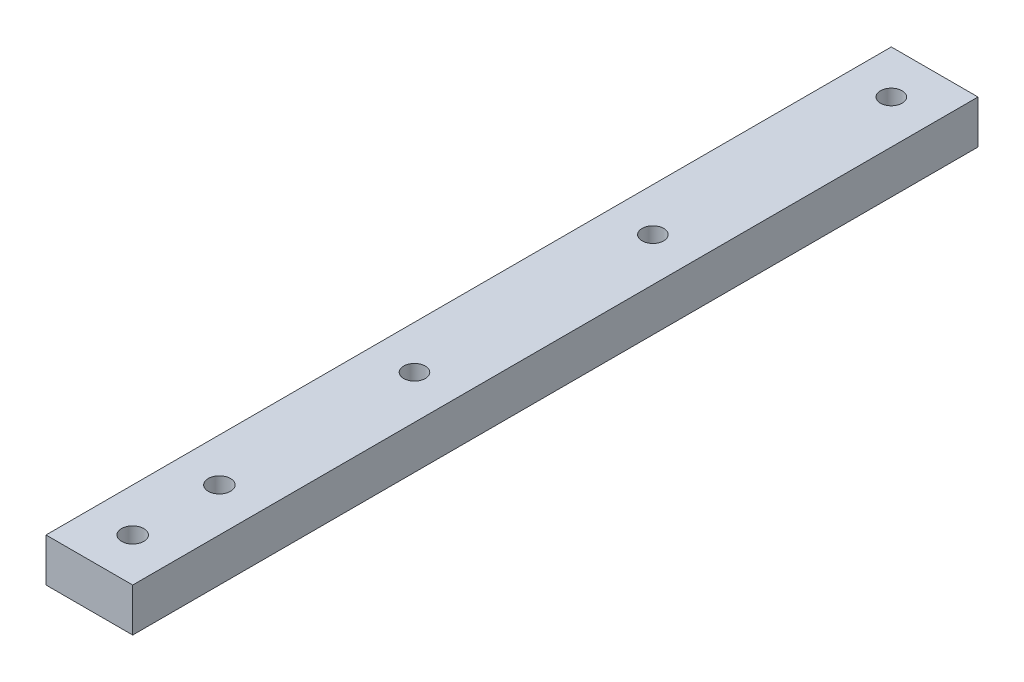
ISO-10303-21;
HEADER;
FILE_DESCRIPTION(('STEP AP214'),'2;1');
FILE_NAME('part.step','',(''),(''),'','','');
FILE_SCHEMA(('AUTOMOTIVE_DESIGN { 1 0 10303 214 1 1 1 1 }'));
ENDSEC;
DATA;
#1=APPLICATION_CONTEXT('core data for automotive mechanical design processes');
#2=APPLICATION_PROTOCOL_DEFINITION('international standard','automotive_design',2000,#1);
#3=PRODUCT_CONTEXT('',#1,'mechanical');
#4=PRODUCT('Part','Part','',(#3));
#5=PRODUCT_RELATED_PRODUCT_CATEGORY('part','',(#4));
#6=PRODUCT_DEFINITION_FORMATION('','',#4);
#7=PRODUCT_DEFINITION_CONTEXT('part definition',#1,'design');
#8=PRODUCT_DEFINITION('design','',#6,#7);
#9=PRODUCT_DEFINITION_SHAPE('','',#8);
#10=(LENGTH_UNIT() NAMED_UNIT(*) SI_UNIT(.MILLI.,.METRE.));
#11=(NAMED_UNIT(*) PLANE_ANGLE_UNIT() SI_UNIT($,.RADIAN.));
#12=(NAMED_UNIT(*) SI_UNIT($,.STERADIAN.) SOLID_ANGLE_UNIT());
#13=UNCERTAINTY_MEASURE_WITH_UNIT(LENGTH_MEASURE(1.E-05),#10,'distance_accuracy_value','');
#14=(GEOMETRIC_REPRESENTATION_CONTEXT(3) GLOBAL_UNCERTAINTY_ASSIGNED_CONTEXT((#13)) GLOBAL_UNIT_ASSIGNED_CONTEXT((#10,
#11,#12)) REPRESENTATION_CONTEXT('',''));
#15=CARTESIAN_POINT('',(0.,0.,0.));
#16=DIRECTION('',(0.,0.,1.));
#17=DIRECTION('',(1.,0.,0.));
#18=AXIS2_PLACEMENT_3D('',#15,#16,#17);
#19=CARTESIAN_POINT('',(12.7,-6.35,247.65));
#20=DIRECTION('',(-1.,0.,0.));
#21=DIRECTION('',(0.,0.,1.));
#22=AXIS2_PLACEMENT_3D('',#19,#20,#21);
#23=PLANE('',#22);
#24=DIRECTION('',(0.,1.,0.));
#25=VECTOR('',#24,1.);
#26=CARTESIAN_POINT('',(12.7,-6.35,0.));
#27=LINE('',#26,#25);
#28=CARTESIAN_POINT('',(12.7,-6.35,0.));
#29=VERTEX_POINT('',#28);
#30=CARTESIAN_POINT('',(12.7,6.35,0.));
#31=VERTEX_POINT('',#30);
#32=EDGE_CURVE('E102',#29,#31,#27,.T.);
#33=ORIENTED_EDGE('',*,*,#32,.T.);
#34=DIRECTION('',(0.,0.,-1.));
#35=VECTOR('',#34,1.);
#36=CARTESIAN_POINT('',(12.7,6.35,247.65));
#37=LINE('',#36,#35);
#38=CARTESIAN_POINT('',(12.7,6.35,247.65));
#39=VERTEX_POINT('',#38);
#40=EDGE_CURVE('E11',#39,#31,#37,.T.);
#41=ORIENTED_EDGE('',*,*,#40,.F.);
#42=DIRECTION('',(0.,1.,0.));
#43=VECTOR('',#42,1.);
#44=CARTESIAN_POINT('',(12.7,-6.35,247.65));
#45=LINE('',#44,#43);
#46=CARTESIAN_POINT('',(12.7,-6.35,247.65));
#47=VERTEX_POINT('',#46);
#48=EDGE_CURVE('E90',#47,#39,#45,.T.);
#49=ORIENTED_EDGE('',*,*,#48,.F.);
#50=DIRECTION('',(0.,0.,-1.));
#51=VECTOR('',#50,1.);
#52=CARTESIAN_POINT('',(12.7,-6.35,247.65));
#53=LINE('',#52,#51);
#54=EDGE_CURVE('E98',#47,#29,#53,.T.);
#55=ORIENTED_EDGE('',*,*,#54,.T.);
#56=EDGE_LOOP('',(#33,#41,#49,#55));
#57=FACE_BOUND('',#56,.T.);
#58=ADVANCED_FACE('F38',(#57),#23,.F.);
#59=CARTESIAN_POINT('',(-12.7,6.35,247.65));
#60=DIRECTION('',(0.,-1.,0.));
#61=DIRECTION('',(0.,0.,-1.));
#62=AXIS2_PLACEMENT_3D('',#59,#60,#61);
#63=PLANE('',#62);
#64=CARTESIAN_POINT('',(0.,6.35,82.55));
#65=DIRECTION('',(0.,1.,0.));
#66=DIRECTION('',(0.,0.,1.));
#67=AXIS2_PLACEMENT_3D('',#64,#65,#66);
#68=CIRCLE('',#67,3.175);
#69=CARTESIAN_POINT('',(0.,6.35,85.725));
#70=VERTEX_POINT('',#69);
#71=EDGE_CURVE('E145',#70,#70,#68,.T.);
#72=ORIENTED_EDGE('',*,*,#71,.F.);
#73=EDGE_LOOP('',(#72));
#74=FACE_BOUND('',#73,.T.);
#75=CARTESIAN_POINT('',(0.,6.35,12.7));
#76=DIRECTION('',(0.,1.,0.));
#77=DIRECTION('',(0.,0.,1.));
#78=AXIS2_PLACEMENT_3D('',#75,#76,#77);
#79=CIRCLE('',#78,3.175);
#80=CARTESIAN_POINT('',(0.,6.35,15.875));
#81=VERTEX_POINT('',#80);
#82=EDGE_CURVE('E139',#81,#81,#79,.T.);
#83=ORIENTED_EDGE('',*,*,#82,.F.);
#84=EDGE_LOOP('',(#83));
#85=FACE_BOUND('',#84,.T.);
#86=CARTESIAN_POINT('',(0.,6.35,152.4));
#87=DIRECTION('',(0.,1.,0.));
#88=DIRECTION('',(0.,0.,1.));
#89=AXIS2_PLACEMENT_3D('',#86,#87,#88);
#90=CIRCLE('',#89,3.175);
#91=CARTESIAN_POINT('',(0.,6.35,155.575));
#92=VERTEX_POINT('',#91);
#93=EDGE_CURVE('E133',#92,#92,#90,.T.);
#94=ORIENTED_EDGE('',*,*,#93,.F.);
#95=EDGE_LOOP('',(#94));
#96=FACE_BOUND('',#95,.T.);
#97=CARTESIAN_POINT('',(0.,6.35,234.95));
#98=DIRECTION('',(0.,1.,0.));
#99=DIRECTION('',(0.,0.,1.));
#100=AXIS2_PLACEMENT_3D('',#97,#98,#99);
#101=CIRCLE('',#100,3.2639);
#102=CARTESIAN_POINT('',(0.,6.35,238.2139));
#103=VERTEX_POINT('',#102);
#104=EDGE_CURVE('E127',#103,#103,#101,.T.);
#105=ORIENTED_EDGE('',*,*,#104,.F.);
#106=EDGE_LOOP('',(#105));
#107=FACE_BOUND('',#106,.T.);
#108=CARTESIAN_POINT('',(0.,6.35,209.55));
#109=DIRECTION('',(0.,1.,0.));
#110=DIRECTION('',(0.,0.,1.));
#111=AXIS2_PLACEMENT_3D('',#108,#109,#110);
#112=CIRCLE('',#111,3.2639);
#113=CARTESIAN_POINT('',(0.,6.35,212.8139));
#114=VERTEX_POINT('',#113);
#115=EDGE_CURVE('E120',#114,#114,#112,.T.);
#116=ORIENTED_EDGE('',*,*,#115,.F.);
#117=EDGE_LOOP('',(#116));
#118=FACE_BOUND('',#117,.T.);
#119=DIRECTION('',(-1.,0.,0.));
#120=VECTOR('',#119,1.);
#121=CARTESIAN_POINT('',(-12.7,6.35,0.));
#122=LINE('',#121,#120);
#123=CARTESIAN_POINT('',(-12.7,6.35,0.));
#124=VERTEX_POINT('',#123);
#125=EDGE_CURVE('E94',#31,#124,#122,.T.);
#126=ORIENTED_EDGE('',*,*,#125,.T.);
#127=DIRECTION('',(0.,0.,-1.));
#128=VECTOR('',#127,1.);
#129=CARTESIAN_POINT('',(-12.7,6.35,247.65));
#130=LINE('',#129,#128);
#131=CARTESIAN_POINT('',(-12.7,6.35,247.65));
#132=VERTEX_POINT('',#131);
#133=EDGE_CURVE('E47',#132,#124,#130,.T.);
#134=ORIENTED_EDGE('',*,*,#133,.F.);
#135=DIRECTION('',(-1.,0.,0.));
#136=VECTOR('',#135,1.);
#137=CARTESIAN_POINT('',(-12.7,6.35,247.65));
#138=LINE('',#137,#136);
#139=EDGE_CURVE('E85',#39,#132,#138,.T.);
#140=ORIENTED_EDGE('',*,*,#139,.F.);
#141=ORIENTED_EDGE('',*,*,#40,.T.);
#142=EDGE_LOOP('',(#126,#134,#140,#141));
#143=FACE_BOUND('',#142,.T.);
#144=ADVANCED_FACE('F93',(#74,#85,#96,#107,#118,#143),#63,.F.);
#145=CARTESIAN_POINT('',(-12.7,-6.35,247.65));
#146=DIRECTION('',(1.,0.,0.));
#147=DIRECTION('',(0.,0.,-1.));
#148=AXIS2_PLACEMENT_3D('',#145,#146,#147);
#149=PLANE('',#148);
#150=DIRECTION('',(0.,-1.,0.));
#151=VECTOR('',#150,1.);
#152=CARTESIAN_POINT('',(-12.7,-6.35,0.));
#153=LINE('',#152,#151);
#154=CARTESIAN_POINT('',(-12.7,-6.35,0.));
#155=VERTEX_POINT('',#154);
#156=EDGE_CURVE('E72',#124,#155,#153,.T.);
#157=ORIENTED_EDGE('',*,*,#156,.T.);
#158=DIRECTION('',(0.,0.,-1.));
#159=VECTOR('',#158,1.);
#160=CARTESIAN_POINT('',(-12.7,-6.35,247.65));
#161=LINE('',#160,#159);
#162=CARTESIAN_POINT('',(-12.7,-6.35,247.65));
#163=VERTEX_POINT('',#162);
#164=EDGE_CURVE('E95',#163,#155,#161,.T.);
#165=ORIENTED_EDGE('',*,*,#164,.F.);
#166=DIRECTION('',(0.,-1.,0.));
#167=VECTOR('',#166,1.);
#168=CARTESIAN_POINT('',(-12.7,-6.35,247.65));
#169=LINE('',#168,#167);
#170=EDGE_CURVE('E88',#132,#163,#169,.T.);
#171=ORIENTED_EDGE('',*,*,#170,.F.);
#172=ORIENTED_EDGE('',*,*,#133,.T.);
#173=EDGE_LOOP('',(#157,#165,#171,#172));
#174=FACE_BOUND('',#173,.T.);
#175=ADVANCED_FACE('F96',(#174),#149,.F.);
#176=CARTESIAN_POINT('',(-12.7,-6.35,247.65));
#177=DIRECTION('',(0.,1.,0.));
#178=DIRECTION('',(0.,0.,1.));
#179=AXIS2_PLACEMENT_3D('',#176,#177,#178);
#180=PLANE('',#179);
#181=CARTESIAN_POINT('',(0.,-6.35,82.55));
#182=DIRECTION('',(0.,1.,0.));
#183=DIRECTION('',(0.,0.,1.));
#184=AXIS2_PLACEMENT_3D('',#181,#182,#183);
#185=CIRCLE('',#184,3.175);
#186=CARTESIAN_POINT('',(0.,-6.35,85.725));
#187=VERTEX_POINT('',#186);
#188=EDGE_CURVE('E142',#187,#187,#185,.T.);
#189=ORIENTED_EDGE('',*,*,#188,.T.);
#190=EDGE_LOOP('',(#189));
#191=FACE_BOUND('',#190,.T.);
#192=CARTESIAN_POINT('',(0.,-6.35,12.7));
#193=DIRECTION('',(0.,1.,0.));
#194=DIRECTION('',(0.,0.,1.));
#195=AXIS2_PLACEMENT_3D('',#192,#193,#194);
#196=CIRCLE('',#195,3.175);
#197=CARTESIAN_POINT('',(0.,-6.35,15.875));
#198=VERTEX_POINT('',#197);
#199=EDGE_CURVE('E136',#198,#198,#196,.T.);
#200=ORIENTED_EDGE('',*,*,#199,.T.);
#201=EDGE_LOOP('',(#200));
#202=FACE_BOUND('',#201,.T.);
#203=CARTESIAN_POINT('',(0.,-6.35,152.4));
#204=DIRECTION('',(0.,1.,0.));
#205=DIRECTION('',(0.,0.,1.));
#206=AXIS2_PLACEMENT_3D('',#203,#204,#205);
#207=CIRCLE('',#206,3.175);
#208=CARTESIAN_POINT('',(0.,-6.35,155.575));
#209=VERTEX_POINT('',#208);
#210=EDGE_CURVE('E130',#209,#209,#207,.T.);
#211=ORIENTED_EDGE('',*,*,#210,.T.);
#212=EDGE_LOOP('',(#211));
#213=FACE_BOUND('',#212,.T.);
#214=CARTESIAN_POINT('',(0.,-6.35,234.95));
#215=DIRECTION('',(0.,1.,0.));
#216=DIRECTION('',(0.,0.,1.));
#217=AXIS2_PLACEMENT_3D('',#214,#215,#216);
#218=CIRCLE('',#217,3.2639);
#219=CARTESIAN_POINT('',(0.,-6.35,238.2139));
#220=VERTEX_POINT('',#219);
#221=EDGE_CURVE('E124',#220,#220,#218,.T.);
#222=ORIENTED_EDGE('',*,*,#221,.T.);
#223=EDGE_LOOP('',(#222));
#224=FACE_BOUND('',#223,.T.);
#225=CARTESIAN_POINT('',(0.,-6.35,209.55));
#226=DIRECTION('',(0.,1.,0.));
#227=DIRECTION('',(0.,0.,1.));
#228=AXIS2_PLACEMENT_3D('',#225,#226,#227);
#229=CIRCLE('',#228,3.2639);
#230=CARTESIAN_POINT('',(0.,-6.35,212.8139));
#231=VERTEX_POINT('',#230);
#232=EDGE_CURVE('E105',#231,#231,#229,.T.);
#233=ORIENTED_EDGE('',*,*,#232,.T.);
#234=EDGE_LOOP('',(#233));
#235=FACE_BOUND('',#234,.T.);
#236=DIRECTION('',(1.,0.,0.));
#237=VECTOR('',#236,1.);
#238=CARTESIAN_POINT('',(-12.7,-6.35,0.));
#239=LINE('',#238,#237);
#240=EDGE_CURVE('E78',#155,#29,#239,.T.);
#241=ORIENTED_EDGE('',*,*,#240,.T.);
#242=ORIENTED_EDGE('',*,*,#54,.F.);
#243=DIRECTION('',(1.,0.,0.));
#244=VECTOR('',#243,1.);
#245=CARTESIAN_POINT('',(-12.7,-6.35,247.65));
#246=LINE('',#245,#244);
#247=EDGE_CURVE('E55',#163,#47,#246,.T.);
#248=ORIENTED_EDGE('',*,*,#247,.F.);
#249=ORIENTED_EDGE('',*,*,#164,.T.);
#250=EDGE_LOOP('',(#241,#242,#248,#249));
#251=FACE_BOUND('',#250,.T.);
#252=ADVANCED_FACE('F111',(#191,#202,#213,#224,#235,#251),#180,.F.);
#253=CARTESIAN_POINT('',(0.,0.,247.65));
#254=DIRECTION('',(0.,0.,-1.));
#255=DIRECTION('',(-1.,0.,0.));
#256=AXIS2_PLACEMENT_3D('',#253,#254,#255);
#257=PLANE('',#256);
#258=ORIENTED_EDGE('',*,*,#48,.T.);
#259=ORIENTED_EDGE('',*,*,#139,.T.);
#260=ORIENTED_EDGE('',*,*,#170,.T.);
#261=ORIENTED_EDGE('',*,*,#247,.T.);
#262=EDGE_LOOP('',(#258,#259,#260,#261));
#263=FACE_BOUND('',#262,.T.);
#264=ADVANCED_FACE('F86',(#263),#257,.F.);
#265=CARTESIAN_POINT('',(0.,0.,0.));
#266=DIRECTION('',(0.,0.,-1.));
#267=DIRECTION('',(-1.,0.,0.));
#268=AXIS2_PLACEMENT_3D('',#265,#266,#267);
#269=PLANE('',#268);
#270=ORIENTED_EDGE('',*,*,#32,.F.);
#271=ORIENTED_EDGE('',*,*,#240,.F.);
#272=ORIENTED_EDGE('',*,*,#156,.F.);
#273=ORIENTED_EDGE('',*,*,#125,.F.);
#274=EDGE_LOOP('',(#270,#271,#272,#273));
#275=FACE_BOUND('',#274,.T.);
#276=ADVANCED_FACE('F114',(#275),#269,.T.);
#277=CARTESIAN_POINT('',(0.,6.35,209.55));
#278=DIRECTION('',(0.,1.,0.));
#279=DIRECTION('',(0.,0.,1.));
#280=AXIS2_PLACEMENT_3D('',#277,#278,#279);
#281=CYLINDRICAL_SURFACE('',#280,3.2639);
#282=ORIENTED_EDGE('',*,*,#232,.F.);
#283=EDGE_LOOP('',(#282));
#284=FACE_BOUND('',#283,.T.);
#285=ORIENTED_EDGE('',*,*,#115,.T.);
#286=EDGE_LOOP('',(#285));
#287=FACE_BOUND('',#286,.T.);
#288=ADVANCED_FACE('F161',(#284,#287),#281,.F.);
#289=CARTESIAN_POINT('',(0.,6.35,234.95));
#290=DIRECTION('',(0.,1.,0.));
#291=DIRECTION('',(0.,0.,1.));
#292=AXIS2_PLACEMENT_3D('',#289,#290,#291);
#293=CYLINDRICAL_SURFACE('',#292,3.2639);
#294=ORIENTED_EDGE('',*,*,#221,.F.);
#295=EDGE_LOOP('',(#294));
#296=FACE_BOUND('',#295,.T.);
#297=ORIENTED_EDGE('',*,*,#104,.T.);
#298=EDGE_LOOP('',(#297));
#299=FACE_BOUND('',#298,.T.);
#300=ADVANCED_FACE('F163',(#296,#299),#293,.F.);
#301=CARTESIAN_POINT('',(0.,6.35,152.4));
#302=DIRECTION('',(0.,1.,0.));
#303=DIRECTION('',(0.,0.,1.));
#304=AXIS2_PLACEMENT_3D('',#301,#302,#303);
#305=CYLINDRICAL_SURFACE('',#304,3.175);
#306=ORIENTED_EDGE('',*,*,#210,.F.);
#307=EDGE_LOOP('',(#306));
#308=FACE_BOUND('',#307,.T.);
#309=ORIENTED_EDGE('',*,*,#93,.T.);
#310=EDGE_LOOP('',(#309));
#311=FACE_BOUND('',#310,.T.);
#312=ADVANCED_FACE('F170',(#308,#311),#305,.F.);
#313=CARTESIAN_POINT('',(0.,6.35,12.7));
#314=DIRECTION('',(0.,1.,0.));
#315=DIRECTION('',(0.,0.,1.));
#316=AXIS2_PLACEMENT_3D('',#313,#314,#315);
#317=CYLINDRICAL_SURFACE('',#316,3.175);
#318=ORIENTED_EDGE('',*,*,#199,.F.);
#319=EDGE_LOOP('',(#318));
#320=FACE_BOUND('',#319,.T.);
#321=ORIENTED_EDGE('',*,*,#82,.T.);
#322=EDGE_LOOP('',(#321));
#323=FACE_BOUND('',#322,.T.);
#324=ADVANCED_FACE('F224',(#320,#323),#317,.F.);
#325=CARTESIAN_POINT('',(0.,6.35,82.55));
#326=DIRECTION('',(0.,1.,0.));
#327=DIRECTION('',(0.,0.,1.));
#328=AXIS2_PLACEMENT_3D('',#325,#326,#327);
#329=CYLINDRICAL_SURFACE('',#328,3.175);
#330=ORIENTED_EDGE('',*,*,#188,.F.);
#331=EDGE_LOOP('',(#330));
#332=FACE_BOUND('',#331,.T.);
#333=ORIENTED_EDGE('',*,*,#71,.T.);
#334=EDGE_LOOP('',(#333));
#335=FACE_BOUND('',#334,.T.);
#336=ADVANCED_FACE('F149',(#332,#335),#329,.F.);
#337=CLOSED_SHELL('',(#58,#144,#175,#252,#264,#276,#288,#300,#312,#324,#336));
#338=MANIFOLD_SOLID_BREP('B2',#337);
#339=ADVANCED_BREP_SHAPE_REPRESENTATION('',(#18,#338),#14);
#340=SHAPE_DEFINITION_REPRESENTATION(#9,#339);
ENDSEC;
END-ISO-10303-21;
